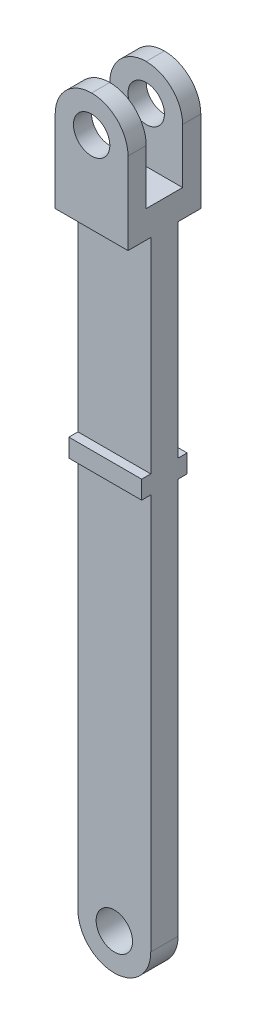
ISO-10303-21;
HEADER;
FILE_DESCRIPTION(('STEP AP214'),'2;1');
FILE_NAME('part.step','',(''),(''),'','','');
FILE_SCHEMA(('AUTOMOTIVE_DESIGN { 1 0 10303 214 1 1 1 1 }'));
ENDSEC;
DATA;
#1=APPLICATION_CONTEXT('core data for automotive mechanical design processes');
#2=APPLICATION_PROTOCOL_DEFINITION('international standard','automotive_design',2000,#1);
#3=PRODUCT_CONTEXT('',#1,'mechanical');
#4=PRODUCT('Part','Part','',(#3));
#5=PRODUCT_RELATED_PRODUCT_CATEGORY('part','',(#4));
#6=PRODUCT_DEFINITION_FORMATION('','',#4);
#7=PRODUCT_DEFINITION_CONTEXT('part definition',#1,'design');
#8=PRODUCT_DEFINITION('design','',#6,#7);
#9=PRODUCT_DEFINITION_SHAPE('','',#8);
#10=(LENGTH_UNIT() NAMED_UNIT(*) SI_UNIT(.MILLI.,.METRE.));
#11=(NAMED_UNIT(*) PLANE_ANGLE_UNIT() SI_UNIT($,.RADIAN.));
#12=(NAMED_UNIT(*) SI_UNIT($,.STERADIAN.) SOLID_ANGLE_UNIT());
#13=UNCERTAINTY_MEASURE_WITH_UNIT(LENGTH_MEASURE(1.E-05),#10,'distance_accuracy_value','');
#14=(GEOMETRIC_REPRESENTATION_CONTEXT(3) GLOBAL_UNCERTAINTY_ASSIGNED_CONTEXT((#13)) GLOBAL_UNIT_ASSIGNED_CONTEXT((#10,
#11,#12)) REPRESENTATION_CONTEXT('',''));
#15=CARTESIAN_POINT('',(0.,0.,0.));
#16=DIRECTION('',(0.,0.,1.));
#17=DIRECTION('',(1.,0.,0.));
#18=AXIS2_PLACEMENT_3D('',#15,#16,#17);
#19=CARTESIAN_POINT('',(4.,32.5,3.));
#20=DIRECTION('',(0.,-1.,0.));
#21=DIRECTION('',(0.,0.,-1.));
#22=AXIS2_PLACEMENT_3D('',#19,#20,#21);
#23=PLANE('',#22);
#24=DIRECTION('',(0.,0.,-1.));
#25=VECTOR('',#24,1.);
#26=CARTESIAN_POINT('',(-4.,32.5,3.));
#27=LINE('',#26,#25);
#28=CARTESIAN_POINT('',(-4.,32.5,3.5));
#29=VERTEX_POINT('',#28);
#30=CARTESIAN_POINT('',(-4.,32.5,-0.5));
#31=VERTEX_POINT('',#30);
#32=EDGE_CURVE('E315',#29,#31,#27,.T.);
#33=ORIENTED_EDGE('',*,*,#32,.F.);
#34=DIRECTION('',(1.,0.,0.));
#35=VECTOR('',#34,1.);
#36=CARTESIAN_POINT('',(-4.,32.5,3.5));
#37=LINE('',#36,#35);
#38=CARTESIAN_POINT('',(4.,32.5,3.5));
#39=VERTEX_POINT('',#38);
#40=EDGE_CURVE('E360',#29,#39,#37,.T.);
#41=ORIENTED_EDGE('',*,*,#40,.T.);
#42=DIRECTION('',(0.,0.,-1.));
#43=VECTOR('',#42,1.);
#44=CARTESIAN_POINT('',(4.,32.5,3.));
#45=LINE('',#44,#43);
#46=CARTESIAN_POINT('',(4.,32.5,-0.5));
#47=VERTEX_POINT('',#46);
#48=EDGE_CURVE('E322',#39,#47,#45,.T.);
#49=ORIENTED_EDGE('',*,*,#48,.T.);
#50=DIRECTION('',(1.,0.,0.));
#51=VECTOR('',#50,1.);
#52=CARTESIAN_POINT('',(-4.,32.5,-0.5));
#53=LINE('',#52,#51);
#54=EDGE_CURVE('E226',#31,#47,#53,.T.);
#55=ORIENTED_EDGE('',*,*,#54,.F.);
#56=EDGE_LOOP('',(#33,#41,#49,#55));
#57=FACE_BOUND('',#56,.T.);
#58=ADVANCED_FACE('F34',(#57),#23,.F.);
#59=CARTESIAN_POINT('',(0.,0.,0.));
#60=DIRECTION('',(0.,0.,1.));
#61=DIRECTION('',(1.,0.,0.));
#62=AXIS2_PLACEMENT_3D('',#59,#60,#61);
#63=PLANE('',#62);
#64=DIRECTION('',(-1.,0.,0.));
#65=VECTOR('',#64,1.);
#66=CARTESIAN_POINT('',(4.,29.5,0.));
#67=LINE('',#66,#65);
#68=CARTESIAN_POINT('',(4.,29.5,0.));
#69=VERTEX_POINT('',#68);
#70=CARTESIAN_POINT('',(-4.,29.5,0.));
#71=VERTEX_POINT('',#70);
#72=EDGE_CURVE('E235',#69,#71,#67,.T.);
#73=ORIENTED_EDGE('',*,*,#72,.F.);
#74=DIRECTION('',(0.,1.,0.));
#75=VECTOR('',#74,1.);
#76=CARTESIAN_POINT('',(4.,-42.5,0.));
#77=LINE('',#76,#75);
#78=CARTESIAN_POINT('',(4.,7.,0.));
#79=VERTEX_POINT('',#78);
#80=EDGE_CURVE('E318',#79,#69,#77,.T.);
#81=ORIENTED_EDGE('',*,*,#80,.F.);
#82=DIRECTION('',(-1.,0.,0.));
#83=VECTOR('',#82,1.);
#84=CARTESIAN_POINT('',(-4.,7.,0.));
#85=LINE('',#84,#83);
#86=CARTESIAN_POINT('',(-4.,7.,0.));
#87=VERTEX_POINT('',#86);
#88=EDGE_CURVE('E254',#79,#87,#85,.T.);
#89=ORIENTED_EDGE('',*,*,#88,.T.);
#90=DIRECTION('',(0.,-1.,0.));
#91=VECTOR('',#90,1.);
#92=CARTESIAN_POINT('',(-4.,-42.5,0.));
#93=LINE('',#92,#91);
#94=EDGE_CURVE('E316',#71,#87,#93,.T.);
#95=ORIENTED_EDGE('',*,*,#94,.F.);
#96=EDGE_LOOP('',(#73,#81,#89,#95));
#97=FACE_BOUND('',#96,.T.);
#98=ADVANCED_FACE('F412',(#97),#63,.F.);
#99=CARTESIAN_POINT('',(0.,0.,3.));
#100=DIRECTION('',(0.,0.,1.));
#101=DIRECTION('',(1.,0.,0.));
#102=AXIS2_PLACEMENT_3D('',#99,#100,#101);
#103=PLANE('',#102);
#104=DIRECTION('',(0.,-1.,0.));
#105=VECTOR('',#104,1.);
#106=CARTESIAN_POINT('',(-4.,-42.5,3.));
#107=LINE('',#106,#105);
#108=CARTESIAN_POINT('',(-4.,5.,3.));
#109=VERTEX_POINT('',#108);
#110=CARTESIAN_POINT('',(-4.,-38.5,3.));
#111=VERTEX_POINT('',#110);
#112=EDGE_CURVE('E312',#109,#111,#107,.T.);
#113=ORIENTED_EDGE('',*,*,#112,.T.);
#114=CARTESIAN_POINT('',(0.,-38.5,3.));
#115=DIRECTION('',(0.,0.,1.));
#116=DIRECTION('',(1.,0.,0.));
#117=AXIS2_PLACEMENT_3D('',#114,#115,#116);
#118=CIRCLE('',#117,4.);
#119=CARTESIAN_POINT('',(0.,-42.5,3.));
#120=VERTEX_POINT('',#119);
#121=EDGE_CURVE('E337',#111,#120,#118,.T.);
#122=ORIENTED_EDGE('',*,*,#121,.T.);
#123=CARTESIAN_POINT('',(0.,-38.5,3.));
#124=DIRECTION('',(0.,0.,1.));
#125=DIRECTION('',(1.,0.,0.));
#126=AXIS2_PLACEMENT_3D('',#123,#124,#125);
#127=CIRCLE('',#126,4.);
#128=CARTESIAN_POINT('',(4.,-38.5,3.));
#129=VERTEX_POINT('',#128);
#130=EDGE_CURVE('E335',#120,#129,#127,.T.);
#131=ORIENTED_EDGE('',*,*,#130,.T.);
#132=DIRECTION('',(0.,1.,0.));
#133=VECTOR('',#132,1.);
#134=CARTESIAN_POINT('',(4.,-42.5,3.));
#135=LINE('',#134,#133);
#136=CARTESIAN_POINT('',(4.,5.,3.));
#137=VERTEX_POINT('',#136);
#138=EDGE_CURVE('E313',#129,#137,#135,.T.);
#139=ORIENTED_EDGE('',*,*,#138,.T.);
#140=DIRECTION('',(1.,0.,0.));
#141=VECTOR('',#140,1.);
#142=CARTESIAN_POINT('',(-4.,5.,3.));
#143=LINE('',#142,#141);
#144=EDGE_CURVE('E282',#109,#137,#143,.T.);
#145=ORIENTED_EDGE('',*,*,#144,.F.);
#146=EDGE_LOOP('',(#113,#122,#131,#139,#145));
#147=FACE_BOUND('',#146,.T.);
#148=CARTESIAN_POINT('',(0.,-38.5,3.));
#149=DIRECTION('',(0.,0.,1.));
#150=DIRECTION('',(1.,0.,0.));
#151=AXIS2_PLACEMENT_3D('',#148,#149,#150);
#152=CIRCLE('',#151,2.);
#153=CARTESIAN_POINT('',(2.,-38.5,3.));
#154=VERTEX_POINT('',#153);
#155=EDGE_CURVE('E303',#154,#154,#152,.T.);
#156=ORIENTED_EDGE('',*,*,#155,.F.);
#157=EDGE_LOOP('',(#156));
#158=FACE_BOUND('',#157,.T.);
#159=ADVANCED_FACE('F439',(#147,#158),#103,.T.);
#160=CARTESIAN_POINT('',(-4.,-42.5,3.));
#161=DIRECTION('',(1.,0.,0.));
#162=DIRECTION('',(0.,0.,-1.));
#163=AXIS2_PLACEMENT_3D('',#160,#161,#162);
#164=PLANE('',#163);
#165=DIRECTION('',(0.,1.,0.));
#166=VECTOR('',#165,1.);
#167=CARTESIAN_POINT('',(-4.,29.5,5.5));
#168=LINE('',#167,#166);
#169=CARTESIAN_POINT('',(-4.,29.5,5.5));
#170=VERTEX_POINT('',#169);
#171=CARTESIAN_POINT('',(-4.,38.5,5.5));
#172=VERTEX_POINT('',#171);
#173=EDGE_CURVE('E194',#170,#172,#168,.T.);
#174=ORIENTED_EDGE('',*,*,#173,.T.);
#175=DIRECTION('',(0.,0.,-1.));
#176=VECTOR('',#175,1.);
#177=CARTESIAN_POINT('',(-4.,38.5,3.5));
#178=LINE('',#177,#176);
#179=CARTESIAN_POINT('',(-4.,38.5,3.5));
#180=VERTEX_POINT('',#179);
#181=EDGE_CURVE('E352',#172,#180,#178,.T.);
#182=ORIENTED_EDGE('',*,*,#181,.T.);
#183=DIRECTION('',(0.,-1.,0.));
#184=VECTOR('',#183,1.);
#185=CARTESIAN_POINT('',(-4.,42.5,3.5));
#186=LINE('',#185,#184);
#187=EDGE_CURVE('E373',#180,#29,#186,.T.);
#188=ORIENTED_EDGE('',*,*,#187,.T.);
#189=ORIENTED_EDGE('',*,*,#32,.T.);
#190=DIRECTION('',(0.,-1.,0.));
#191=VECTOR('',#190,1.);
#192=CARTESIAN_POINT('',(-4.,42.5,-0.5));
#193=LINE('',#192,#191);
#194=CARTESIAN_POINT('',(-4.,38.5,-0.5));
#195=VERTEX_POINT('',#194);
#196=EDGE_CURVE('E232',#195,#31,#193,.T.);
#197=ORIENTED_EDGE('',*,*,#196,.F.);
#198=DIRECTION('',(0.,0.,1.));
#199=VECTOR('',#198,1.);
#200=CARTESIAN_POINT('',(-4.,38.5,-2.5));
#201=LINE('',#200,#199);
#202=CARTESIAN_POINT('',(-4.,38.5,-2.5));
#203=VERTEX_POINT('',#202);
#204=EDGE_CURVE('E330',#195,#203,#201,.F.);
#205=ORIENTED_EDGE('',*,*,#204,.T.);
#206=DIRECTION('',(0.,1.,0.));
#207=VECTOR('',#206,1.);
#208=CARTESIAN_POINT('',(-4.,29.5,-2.5));
#209=LINE('',#208,#207);
#210=CARTESIAN_POINT('',(-4.,29.5,-2.5));
#211=VERTEX_POINT('',#210);
#212=EDGE_CURVE('E236',#211,#203,#209,.T.);
#213=ORIENTED_EDGE('',*,*,#212,.F.);
#214=DIRECTION('',(0.,0.,1.));
#215=VECTOR('',#214,1.);
#216=CARTESIAN_POINT('',(-4.,29.5,-2.5));
#217=LINE('',#216,#215);
#218=EDGE_CURVE('E243',#211,#71,#217,.T.);
#219=ORIENTED_EDGE('',*,*,#218,.T.);
#220=ORIENTED_EDGE('',*,*,#94,.T.);
#221=DIRECTION('',(0.,0.,1.));
#222=VECTOR('',#221,1.);
#223=CARTESIAN_POINT('',(-4.,7.,-1.));
#224=LINE('',#223,#222);
#225=CARTESIAN_POINT('',(-4.,7.,-1.));
#226=VERTEX_POINT('',#225);
#227=EDGE_CURVE('E269',#226,#87,#224,.T.);
#228=ORIENTED_EDGE('',*,*,#227,.F.);
#229=DIRECTION('',(0.,-1.,0.));
#230=VECTOR('',#229,1.);
#231=CARTESIAN_POINT('',(-4.,5.,-1.));
#232=LINE('',#231,#230);
#233=CARTESIAN_POINT('',(-4.,5.,-1.));
#234=VERTEX_POINT('',#233);
#235=EDGE_CURVE('E257',#226,#234,#232,.T.);
#236=ORIENTED_EDGE('',*,*,#235,.T.);
#237=DIRECTION('',(0.,0.,1.));
#238=VECTOR('',#237,1.);
#239=CARTESIAN_POINT('',(-4.,5.,-1.));
#240=LINE('',#239,#238);
#241=CARTESIAN_POINT('',(-4.,5.,0.));
#242=VERTEX_POINT('',#241);
#243=EDGE_CURVE('E272',#234,#242,#240,.T.);
#244=ORIENTED_EDGE('',*,*,#243,.T.);
#245=CARTESIAN_POINT('',(-4.,-38.5,0.));
#246=VERTEX_POINT('',#245);
#247=EDGE_CURVE('E307',#242,#246,#93,.T.);
#248=ORIENTED_EDGE('',*,*,#247,.T.);
#249=DIRECTION('',(0.,0.,-1.));
#250=VECTOR('',#249,1.);
#251=CARTESIAN_POINT('',(-4.,-38.5,3.));
#252=LINE('',#251,#250);
#253=EDGE_CURVE('E332',#246,#111,#252,.F.);
#254=ORIENTED_EDGE('',*,*,#253,.T.);
#255=ORIENTED_EDGE('',*,*,#112,.F.);
#256=DIRECTION('',(0.,0.,-1.));
#257=VECTOR('',#256,1.);
#258=CARTESIAN_POINT('',(-4.,5.,4.));
#259=LINE('',#258,#257);
#260=CARTESIAN_POINT('',(-4.,5.,4.));
#261=VERTEX_POINT('',#260);
#262=EDGE_CURVE('E295',#261,#109,#259,.T.);
#263=ORIENTED_EDGE('',*,*,#262,.F.);
#264=DIRECTION('',(0.,-1.,0.));
#265=VECTOR('',#264,1.);
#266=CARTESIAN_POINT('',(-4.,5.,4.));
#267=LINE('',#266,#265);
#268=CARTESIAN_POINT('',(-4.,7.,4.));
#269=VERTEX_POINT('',#268);
#270=EDGE_CURVE('E284',#269,#261,#267,.T.);
#271=ORIENTED_EDGE('',*,*,#270,.F.);
#272=DIRECTION('',(0.,0.,-1.));
#273=VECTOR('',#272,1.);
#274=CARTESIAN_POINT('',(-4.,7.,4.));
#275=LINE('',#274,#273);
#276=CARTESIAN_POINT('',(-4.,7.,3.));
#277=VERTEX_POINT('',#276);
#278=EDGE_CURVE('E298',#269,#277,#275,.T.);
#279=ORIENTED_EDGE('',*,*,#278,.T.);
#280=CARTESIAN_POINT('',(-4.,29.5,3.));
#281=VERTEX_POINT('',#280);
#282=EDGE_CURVE('E197',#281,#277,#107,.T.);
#283=ORIENTED_EDGE('',*,*,#282,.F.);
#284=DIRECTION('',(0.,0.,-1.));
#285=VECTOR('',#284,1.);
#286=CARTESIAN_POINT('',(-4.,29.5,5.5));
#287=LINE('',#286,#285);
#288=EDGE_CURVE('E190',#170,#281,#287,.T.);
#289=ORIENTED_EDGE('',*,*,#288,.F.);
#290=EDGE_LOOP('',(#174,#182,#188,#189,#197,#205,#213,#219,#220,#228,#236,#244,#248,#254,#255,
#263,#271,#279,#283,#289));
#291=FACE_BOUND('',#290,.T.);
#292=ADVANCED_FACE('F192',(#291),#164,.F.);
#293=CARTESIAN_POINT('',(4.,-42.5,3.));
#294=DIRECTION('',(-1.,0.,0.));
#295=DIRECTION('',(0.,-1.,0.));
#296=AXIS2_PLACEMENT_3D('',#293,#294,#295);
#297=PLANE('',#296);
#298=DIRECTION('',(0.,-1.,0.));
#299=VECTOR('',#298,1.);
#300=CARTESIAN_POINT('',(4.,42.5,3.5));
#301=LINE('',#300,#299);
#302=CARTESIAN_POINT('',(4.,38.5,3.5));
#303=VERTEX_POINT('',#302);
#304=EDGE_CURVE('E219',#303,#39,#301,.T.);
#305=ORIENTED_EDGE('',*,*,#304,.F.);
#306=DIRECTION('',(0.,0.,1.));
#307=VECTOR('',#306,1.);
#308=CARTESIAN_POINT('',(4.,38.5,5.5));
#309=LINE('',#308,#307);
#310=CARTESIAN_POINT('',(4.,38.5,5.5));
#311=VERTEX_POINT('',#310);
#312=EDGE_CURVE('E11',#303,#311,#309,.T.);
#313=ORIENTED_EDGE('',*,*,#312,.T.);
#314=DIRECTION('',(0.,-1.,0.));
#315=VECTOR('',#314,1.);
#316=CARTESIAN_POINT('',(4.,29.5,5.5));
#317=LINE('',#316,#315);
#318=CARTESIAN_POINT('',(4.,29.5,5.5));
#319=VERTEX_POINT('',#318);
#320=EDGE_CURVE('E213',#311,#319,#317,.T.);
#321=ORIENTED_EDGE('',*,*,#320,.T.);
#322=DIRECTION('',(0.,0.,-1.));
#323=VECTOR('',#322,1.);
#324=CARTESIAN_POINT('',(4.,29.5,5.5));
#325=LINE('',#324,#323);
#326=CARTESIAN_POINT('',(4.,29.5,3.));
#327=VERTEX_POINT('',#326);
#328=EDGE_CURVE('E202',#319,#327,#325,.T.);
#329=ORIENTED_EDGE('',*,*,#328,.T.);
#330=CARTESIAN_POINT('',(4.,7.,3.));
#331=VERTEX_POINT('',#330);
#332=EDGE_CURVE('E311',#331,#327,#135,.T.);
#333=ORIENTED_EDGE('',*,*,#332,.F.);
#334=DIRECTION('',(0.,0.,-1.));
#335=VECTOR('',#334,1.);
#336=CARTESIAN_POINT('',(4.,7.,4.));
#337=LINE('',#336,#335);
#338=CARTESIAN_POINT('',(4.,7.,4.));
#339=VERTEX_POINT('',#338);
#340=EDGE_CURVE('E300',#339,#331,#337,.T.);
#341=ORIENTED_EDGE('',*,*,#340,.F.);
#342=DIRECTION('',(0.,1.,0.));
#343=VECTOR('',#342,1.);
#344=CARTESIAN_POINT('',(4.,5.,4.));
#345=LINE('',#344,#343);
#346=CARTESIAN_POINT('',(4.,5.,4.));
#347=VERTEX_POINT('',#346);
#348=EDGE_CURVE('E278',#347,#339,#345,.T.);
#349=ORIENTED_EDGE('',*,*,#348,.F.);
#350=DIRECTION('',(0.,0.,-1.));
#351=VECTOR('',#350,1.);
#352=CARTESIAN_POINT('',(4.,5.,4.));
#353=LINE('',#352,#351);
#354=EDGE_CURVE('E288',#347,#137,#353,.T.);
#355=ORIENTED_EDGE('',*,*,#354,.T.);
#356=ORIENTED_EDGE('',*,*,#138,.F.);
#357=DIRECTION('',(0.,0.,-1.));
#358=VECTOR('',#357,1.);
#359=CARTESIAN_POINT('',(4.,-38.5,3.));
#360=LINE('',#359,#358);
#361=CARTESIAN_POINT('',(4.,-38.5,0.));
#362=VERTEX_POINT('',#361);
#363=EDGE_CURVE('E342',#129,#362,#360,.T.);
#364=ORIENTED_EDGE('',*,*,#363,.T.);
#365=CARTESIAN_POINT('',(4.,5.,0.));
#366=VERTEX_POINT('',#365);
#367=EDGE_CURVE('E319',#362,#366,#77,.T.);
#368=ORIENTED_EDGE('',*,*,#367,.T.);
#369=DIRECTION('',(0.,0.,1.));
#370=VECTOR('',#369,1.);
#371=CARTESIAN_POINT('',(4.,5.,-1.));
#372=LINE('',#371,#370);
#373=CARTESIAN_POINT('',(4.,5.,-1.));
#374=VERTEX_POINT('',#373);
#375=EDGE_CURVE('E274',#374,#366,#372,.T.);
#376=ORIENTED_EDGE('',*,*,#375,.F.);
#377=DIRECTION('',(0.,1.,0.));
#378=VECTOR('',#377,1.);
#379=CARTESIAN_POINT('',(4.,5.,-1.));
#380=LINE('',#379,#378);
#381=CARTESIAN_POINT('',(4.,7.,-1.));
#382=VERTEX_POINT('',#381);
#383=EDGE_CURVE('E250',#374,#382,#380,.T.);
#384=ORIENTED_EDGE('',*,*,#383,.T.);
#385=DIRECTION('',(0.,0.,1.));
#386=VECTOR('',#385,1.);
#387=CARTESIAN_POINT('',(4.,7.,-1.));
#388=LINE('',#387,#386);
#389=EDGE_CURVE('E263',#382,#79,#388,.T.);
#390=ORIENTED_EDGE('',*,*,#389,.T.);
#391=ORIENTED_EDGE('',*,*,#80,.T.);
#392=DIRECTION('',(0.,0.,1.));
#393=VECTOR('',#392,1.);
#394=CARTESIAN_POINT('',(4.,29.5,-2.5));
#395=LINE('',#394,#393);
#396=CARTESIAN_POINT('',(4.,29.5,-2.5));
#397=VERTEX_POINT('',#396);
#398=EDGE_CURVE('E247',#397,#69,#395,.T.);
#399=ORIENTED_EDGE('',*,*,#398,.F.);
#400=DIRECTION('',(0.,-1.,0.));
#401=VECTOR('',#400,1.);
#402=CARTESIAN_POINT('',(4.,29.5,-2.5));
#403=LINE('',#402,#401);
#404=CARTESIAN_POINT('',(4.,38.5,-2.5));
#405=VERTEX_POINT('',#404);
#406=EDGE_CURVE('E239',#405,#397,#403,.T.);
#407=ORIENTED_EDGE('',*,*,#406,.F.);
#408=DIRECTION('',(0.,0.,-1.));
#409=VECTOR('',#408,1.);
#410=CARTESIAN_POINT('',(4.,38.5,-0.5));
#411=LINE('',#410,#409);
#412=CARTESIAN_POINT('',(4.,38.5,-0.5));
#413=VERTEX_POINT('',#412);
#414=EDGE_CURVE('E339',#405,#413,#411,.F.);
#415=ORIENTED_EDGE('',*,*,#414,.T.);
#416=DIRECTION('',(0.,-1.,0.));
#417=VECTOR('',#416,1.);
#418=CARTESIAN_POINT('',(4.,42.5,-0.5));
#419=LINE('',#418,#417);
#420=EDGE_CURVE('E229',#413,#47,#419,.T.);
#421=ORIENTED_EDGE('',*,*,#420,.T.);
#422=ORIENTED_EDGE('',*,*,#48,.F.);
#423=EDGE_LOOP('',(#305,#313,#321,#329,#333,#341,#349,#355,#356,#364,#368,#376,#384,#390,#391,
#399,#407,#415,#421,#422));
#424=FACE_BOUND('',#423,.T.);
#425=ADVANCED_FACE('F389',(#424),#297,.F.);
#426=DIRECTION('',(-1.,0.,0.));
#427=VECTOR('',#426,1.);
#428=CARTESIAN_POINT('',(4.,29.5,3.));
#429=LINE('',#428,#427);
#430=EDGE_CURVE('E208',#327,#281,#429,.T.);
#431=ORIENTED_EDGE('',*,*,#430,.T.);
#432=ORIENTED_EDGE('',*,*,#282,.T.);
#433=DIRECTION('',(-1.,0.,0.));
#434=VECTOR('',#433,1.);
#435=CARTESIAN_POINT('',(-4.,7.,3.));
#436=LINE('',#435,#434);
#437=EDGE_CURVE('E277',#331,#277,#436,.T.);
#438=ORIENTED_EDGE('',*,*,#437,.F.);
#439=ORIENTED_EDGE('',*,*,#332,.T.);
#440=EDGE_LOOP('',(#431,#432,#438,#439));
#441=FACE_BOUND('',#440,.T.);
#442=ADVANCED_FACE('F450',(#441),#103,.T.);
#443=CARTESIAN_POINT('',(0.,-38.5,0.));
#444=DIRECTION('',(0.,0.,1.));
#445=DIRECTION('',(1.,0.,0.));
#446=AXIS2_PLACEMENT_3D('',#443,#444,#445);
#447=CIRCLE('',#446,2.);
#448=CARTESIAN_POINT('',(2.,-38.5,0.));
#449=VERTEX_POINT('',#448);
#450=EDGE_CURVE('E304',#449,#449,#447,.T.);
#451=ORIENTED_EDGE('',*,*,#450,.T.);
#452=EDGE_LOOP('',(#451));
#453=FACE_BOUND('',#452,.T.);
#454=CARTESIAN_POINT('',(0.,-38.5,0.));
#455=DIRECTION('',(0.,0.,1.));
#456=DIRECTION('',(1.,0.,0.));
#457=AXIS2_PLACEMENT_3D('',#454,#455,#456);
#458=CIRCLE('',#457,4.);
#459=CARTESIAN_POINT('',(0.,-42.5,0.));
#460=VERTEX_POINT('',#459);
#461=EDGE_CURVE('E324',#362,#460,#458,.F.);
#462=ORIENTED_EDGE('',*,*,#461,.T.);
#463=CARTESIAN_POINT('',(0.,-38.5,0.));
#464=DIRECTION('',(0.,0.,1.));
#465=DIRECTION('',(1.,0.,0.));
#466=AXIS2_PLACEMENT_3D('',#463,#464,#465);
#467=CIRCLE('',#466,4.);
#468=EDGE_CURVE('E328',#460,#246,#467,.F.);
#469=ORIENTED_EDGE('',*,*,#468,.T.);
#470=ORIENTED_EDGE('',*,*,#247,.F.);
#471=DIRECTION('',(1.,0.,0.));
#472=VECTOR('',#471,1.);
#473=CARTESIAN_POINT('',(-4.,5.,0.));
#474=LINE('',#473,#472);
#475=EDGE_CURVE('E249',#242,#366,#474,.T.);
#476=ORIENTED_EDGE('',*,*,#475,.T.);
#477=ORIENTED_EDGE('',*,*,#367,.F.);
#478=EDGE_LOOP('',(#462,#469,#470,#476,#477));
#479=FACE_BOUND('',#478,.T.);
#480=ADVANCED_FACE('F447',(#453,#479),#63,.F.);
#481=CARTESIAN_POINT('',(0.,-38.5,0.));
#482=DIRECTION('',(0.,0.,1.));
#483=DIRECTION('',(1.,0.,0.));
#484=AXIS2_PLACEMENT_3D('',#481,#482,#483);
#485=CYLINDRICAL_SURFACE('',#484,2.);
#486=ORIENTED_EDGE('',*,*,#450,.F.);
#487=EDGE_LOOP('',(#486));
#488=FACE_BOUND('',#487,.T.);
#489=ORIENTED_EDGE('',*,*,#155,.T.);
#490=EDGE_LOOP('',(#489));
#491=FACE_BOUND('',#490,.T.);
#492=ADVANCED_FACE('F449',(#488,#491),#485,.F.);
#493=CARTESIAN_POINT('',(-4.,7.,4.));
#494=DIRECTION('',(0.,-1.,0.));
#495=DIRECTION('',(0.,0.,-1.));
#496=AXIS2_PLACEMENT_3D('',#493,#494,#495);
#497=PLANE('',#496);
#498=ORIENTED_EDGE('',*,*,#437,.T.);
#499=ORIENTED_EDGE('',*,*,#278,.F.);
#500=DIRECTION('',(-1.,0.,0.));
#501=VECTOR('',#500,1.);
#502=CARTESIAN_POINT('',(-4.,7.,4.));
#503=LINE('',#502,#501);
#504=EDGE_CURVE('E281',#339,#269,#503,.T.);
#505=ORIENTED_EDGE('',*,*,#504,.F.);
#506=ORIENTED_EDGE('',*,*,#340,.T.);
#507=EDGE_LOOP('',(#498,#499,#505,#506));
#508=FACE_BOUND('',#507,.T.);
#509=ADVANCED_FACE('F457',(#508),#497,.F.);
#510=CARTESIAN_POINT('',(-4.,5.,4.));
#511=DIRECTION('',(0.,1.,0.));
#512=DIRECTION('',(0.,0.,1.));
#513=AXIS2_PLACEMENT_3D('',#510,#511,#512);
#514=PLANE('',#513);
#515=ORIENTED_EDGE('',*,*,#144,.T.);
#516=ORIENTED_EDGE('',*,*,#354,.F.);
#517=DIRECTION('',(1.,0.,0.));
#518=VECTOR('',#517,1.);
#519=CARTESIAN_POINT('',(-4.,5.,4.));
#520=LINE('',#519,#518);
#521=EDGE_CURVE('E286',#261,#347,#520,.T.);
#522=ORIENTED_EDGE('',*,*,#521,.F.);
#523=ORIENTED_EDGE('',*,*,#262,.T.);
#524=EDGE_LOOP('',(#515,#516,#522,#523));
#525=FACE_BOUND('',#524,.T.);
#526=ADVANCED_FACE('F525',(#525),#514,.F.);
#527=CARTESIAN_POINT('',(0.,0.,4.));
#528=DIRECTION('',(0.,0.,-1.));
#529=DIRECTION('',(-1.,0.,0.));
#530=AXIS2_PLACEMENT_3D('',#527,#528,#529);
#531=PLANE('',#530);
#532=ORIENTED_EDGE('',*,*,#348,.T.);
#533=ORIENTED_EDGE('',*,*,#504,.T.);
#534=ORIENTED_EDGE('',*,*,#270,.T.);
#535=ORIENTED_EDGE('',*,*,#521,.T.);
#536=EDGE_LOOP('',(#532,#533,#534,#535));
#537=FACE_BOUND('',#536,.T.);
#538=ADVANCED_FACE('F522',(#537),#531,.F.);
#539=CARTESIAN_POINT('',(-4.,5.,-1.));
#540=DIRECTION('',(0.,-1.,0.));
#541=DIRECTION('',(0.,0.,-1.));
#542=AXIS2_PLACEMENT_3D('',#539,#540,#541);
#543=PLANE('',#542);
#544=ORIENTED_EDGE('',*,*,#475,.F.);
#545=ORIENTED_EDGE('',*,*,#243,.F.);
#546=DIRECTION('',(1.,0.,0.));
#547=VECTOR('',#546,1.);
#548=CARTESIAN_POINT('',(-4.,5.,-1.));
#549=LINE('',#548,#547);
#550=EDGE_CURVE('E253',#234,#374,#549,.T.);
#551=ORIENTED_EDGE('',*,*,#550,.T.);
#552=ORIENTED_EDGE('',*,*,#375,.T.);
#553=EDGE_LOOP('',(#544,#545,#551,#552));
#554=FACE_BOUND('',#553,.T.);
#555=ADVANCED_FACE('F426',(#554),#543,.T.);
#556=CARTESIAN_POINT('',(-4.,7.,-1.));
#557=DIRECTION('',(0.,1.,0.));
#558=DIRECTION('',(0.,0.,1.));
#559=AXIS2_PLACEMENT_3D('',#556,#557,#558);
#560=PLANE('',#559);
#561=ORIENTED_EDGE('',*,*,#88,.F.);
#562=ORIENTED_EDGE('',*,*,#389,.F.);
#563=DIRECTION('',(-1.,0.,0.));
#564=VECTOR('',#563,1.);
#565=CARTESIAN_POINT('',(-4.,7.,-1.));
#566=LINE('',#565,#564);
#567=EDGE_CURVE('E260',#382,#226,#566,.T.);
#568=ORIENTED_EDGE('',*,*,#567,.T.);
#569=ORIENTED_EDGE('',*,*,#227,.T.);
#570=EDGE_LOOP('',(#561,#562,#568,#569));
#571=FACE_BOUND('',#570,.T.);
#572=ADVANCED_FACE('F417',(#571),#560,.T.);
#573=CARTESIAN_POINT('',(0.,0.,-1.));
#574=DIRECTION('',(0.,0.,1.));
#575=DIRECTION('',(-1.,0.,0.));
#576=AXIS2_PLACEMENT_3D('',#573,#574,#575);
#577=PLANE('',#576);
#578=ORIENTED_EDGE('',*,*,#383,.F.);
#579=ORIENTED_EDGE('',*,*,#550,.F.);
#580=ORIENTED_EDGE('',*,*,#235,.F.);
#581=ORIENTED_EDGE('',*,*,#567,.F.);
#582=EDGE_LOOP('',(#578,#579,#580,#581));
#583=FACE_BOUND('',#582,.T.);
#584=ADVANCED_FACE('F423',(#583),#577,.F.);
#585=CARTESIAN_POINT('',(4.,29.5,-2.5));
#586=DIRECTION('',(0.,1.,0.));
#587=DIRECTION('',(0.,0.,1.));
#588=AXIS2_PLACEMENT_3D('',#585,#586,#587);
#589=PLANE('',#588);
#590=ORIENTED_EDGE('',*,*,#72,.T.);
#591=ORIENTED_EDGE('',*,*,#218,.F.);
#592=DIRECTION('',(-1.,0.,0.));
#593=VECTOR('',#592,1.);
#594=CARTESIAN_POINT('',(4.,29.5,-2.5));
#595=LINE('',#594,#593);
#596=EDGE_CURVE('E241',#397,#211,#595,.T.);
#597=ORIENTED_EDGE('',*,*,#596,.F.);
#598=ORIENTED_EDGE('',*,*,#398,.T.);
#599=EDGE_LOOP('',(#590,#591,#597,#598));
#600=FACE_BOUND('',#599,.T.);
#601=ADVANCED_FACE('F512',(#600),#589,.F.);
#602=CARTESIAN_POINT('',(0.,0.,-2.5));
#603=DIRECTION('',(0.,0.,1.));
#604=DIRECTION('',(1.,0.,0.));
#605=AXIS2_PLACEMENT_3D('',#602,#603,#604);
#606=PLANE('',#605);
#607=CARTESIAN_POINT('',(0.,38.5,-2.5));
#608=DIRECTION('',(0.,0.,-1.));
#609=DIRECTION('',(-1.,0.,0.));
#610=AXIS2_PLACEMENT_3D('',#607,#608,#609);
#611=CIRCLE('',#610,2.);
#612=CARTESIAN_POINT('',(-2.,38.5,-2.5));
#613=VERTEX_POINT('',#612);
#614=EDGE_CURVE('E221',#613,#613,#611,.T.);
#615=ORIENTED_EDGE('',*,*,#614,.F.);
#616=EDGE_LOOP('',(#615));
#617=FACE_BOUND('',#616,.T.);
#618=CARTESIAN_POINT('',(0.,38.5,-2.5));
#619=DIRECTION('',(0.,0.,1.));
#620=DIRECTION('',(1.,0.,0.));
#621=AXIS2_PLACEMENT_3D('',#618,#619,#620);
#622=CIRCLE('',#621,4.);
#623=CARTESIAN_POINT('',(0.,42.5,-2.5));
#624=VERTEX_POINT('',#623);
#625=EDGE_CURVE('E344',#203,#624,#622,.F.);
#626=ORIENTED_EDGE('',*,*,#625,.T.);
#627=CARTESIAN_POINT('',(0.,38.5,-2.5));
#628=DIRECTION('',(0.,0.,1.));
#629=DIRECTION('',(1.,0.,0.));
#630=AXIS2_PLACEMENT_3D('',#627,#628,#629);
#631=CIRCLE('',#630,4.);
#632=EDGE_CURVE('E346',#624,#405,#631,.F.);
#633=ORIENTED_EDGE('',*,*,#632,.T.);
#634=ORIENTED_EDGE('',*,*,#406,.T.);
#635=ORIENTED_EDGE('',*,*,#596,.T.);
#636=ORIENTED_EDGE('',*,*,#212,.T.);
#637=EDGE_LOOP('',(#626,#633,#634,#635,#636));
#638=FACE_BOUND('',#637,.T.);
#639=ADVANCED_FACE('F405',(#617,#638),#606,.F.);
#640=CARTESIAN_POINT('',(-4.,42.5,-0.5));
#641=DIRECTION('',(0.,0.,-1.));
#642=DIRECTION('',(-1.,0.,0.));
#643=AXIS2_PLACEMENT_3D('',#640,#641,#642);
#644=PLANE('',#643);
#645=CARTESIAN_POINT('',(0.,38.5,-0.5));
#646=DIRECTION('',(0.,0.,-1.));
#647=DIRECTION('',(-1.,0.,0.));
#648=AXIS2_PLACEMENT_3D('',#645,#646,#647);
#649=CIRCLE('',#648,2.);
#650=CARTESIAN_POINT('',(-2.,38.5,-0.5));
#651=VERTEX_POINT('',#650);
#652=EDGE_CURVE('E224',#651,#651,#649,.T.);
#653=ORIENTED_EDGE('',*,*,#652,.T.);
#654=EDGE_LOOP('',(#653));
#655=FACE_BOUND('',#654,.T.);
#656=ORIENTED_EDGE('',*,*,#420,.F.);
#657=CARTESIAN_POINT('',(0.,38.5,-0.5));
#658=DIRECTION('',(0.,0.,-1.));
#659=DIRECTION('',(-1.,0.,0.));
#660=AXIS2_PLACEMENT_3D('',#657,#658,#659);
#661=CIRCLE('',#660,4.);
#662=CARTESIAN_POINT('',(0.,42.5,-0.5));
#663=VERTEX_POINT('',#662);
#664=EDGE_CURVE('E350',#413,#663,#661,.F.);
#665=ORIENTED_EDGE('',*,*,#664,.T.);
#666=CARTESIAN_POINT('',(0.,38.5,-0.5));
#667=DIRECTION('',(0.,0.,-1.));
#668=DIRECTION('',(-1.,0.,0.));
#669=AXIS2_PLACEMENT_3D('',#666,#667,#668);
#670=CIRCLE('',#669,4.);
#671=EDGE_CURVE('E348',#663,#195,#670,.F.);
#672=ORIENTED_EDGE('',*,*,#671,.T.);
#673=ORIENTED_EDGE('',*,*,#196,.T.);
#674=ORIENTED_EDGE('',*,*,#54,.T.);
#675=EDGE_LOOP('',(#656,#665,#672,#673,#674));
#676=FACE_BOUND('',#675,.T.);
#677=ADVANCED_FACE('F394',(#655,#676),#644,.F.);
#678=CARTESIAN_POINT('',(0.,38.5,16.));
#679=DIRECTION('',(0.,0.,-1.));
#680=DIRECTION('',(-1.,0.,0.));
#681=AXIS2_PLACEMENT_3D('',#678,#679,#680);
#682=CYLINDRICAL_SURFACE('',#681,2.);
#683=ORIENTED_EDGE('',*,*,#614,.T.);
#684=EDGE_LOOP('',(#683));
#685=FACE_BOUND('',#684,.T.);
#686=ORIENTED_EDGE('',*,*,#652,.F.);
#687=EDGE_LOOP('',(#686));
#688=FACE_BOUND('',#687,.T.);
#689=ADVANCED_FACE('F476',(#685,#688),#682,.F.);
#690=CARTESIAN_POINT('',(0.,-38.5,3.));
#691=DIRECTION('',(0.,0.,-1.));
#692=DIRECTION('',(-1.,0.,0.));
#693=AXIS2_PLACEMENT_3D('',#690,#691,#692);
#694=CYLINDRICAL_SURFACE('',#693,4.);
#695=ORIENTED_EDGE('',*,*,#363,.F.);
#696=ORIENTED_EDGE('',*,*,#130,.F.);
#697=DIRECTION('',(0.,0.,-1.));
#698=VECTOR('',#697,1.);
#699=CARTESIAN_POINT('',(0.,-42.5,3.));
#700=LINE('',#699,#698);
#701=EDGE_CURVE('E225',#460,#120,#700,.F.);
#702=ORIENTED_EDGE('',*,*,#701,.F.);
#703=ORIENTED_EDGE('',*,*,#461,.F.);
#704=EDGE_LOOP('',(#695,#696,#702,#703));
#705=FACE_BOUND('',#704,.T.);
#706=ADVANCED_FACE('F444',(#705),#694,.T.);
#707=CARTESIAN_POINT('',(0.,-38.5,3.));
#708=DIRECTION('',(0.,0.,-1.));
#709=DIRECTION('',(-1.,0.,0.));
#710=AXIS2_PLACEMENT_3D('',#707,#708,#709);
#711=CYLINDRICAL_SURFACE('',#710,4.);
#712=ORIENTED_EDGE('',*,*,#121,.F.);
#713=ORIENTED_EDGE('',*,*,#253,.F.);
#714=ORIENTED_EDGE('',*,*,#468,.F.);
#715=ORIENTED_EDGE('',*,*,#701,.T.);
#716=EDGE_LOOP('',(#712,#713,#714,#715));
#717=FACE_BOUND('',#716,.T.);
#718=ADVANCED_FACE('F435',(#717),#711,.T.);
#719=CARTESIAN_POINT('',(0.,38.5,0.));
#720=DIRECTION('',(0.,0.,-1.));
#721=DIRECTION('',(-1.,0.,0.));
#722=AXIS2_PLACEMENT_3D('',#719,#720,#721);
#723=CYLINDRICAL_SURFACE('',#722,4.);
#724=ORIENTED_EDGE('',*,*,#204,.F.);
#725=ORIENTED_EDGE('',*,*,#671,.F.);
#726=DIRECTION('',(0.,0.,1.));
#727=VECTOR('',#726,1.);
#728=CARTESIAN_POINT('',(0.,42.5,-0.5));
#729=LINE('',#728,#727);
#730=EDGE_CURVE('E201',#624,#663,#729,.T.);
#731=ORIENTED_EDGE('',*,*,#730,.F.);
#732=ORIENTED_EDGE('',*,*,#625,.F.);
#733=EDGE_LOOP('',(#724,#725,#731,#732));
#734=FACE_BOUND('',#733,.T.);
#735=ADVANCED_FACE('F401',(#734),#723,.T.);
#736=CARTESIAN_POINT('',(0.,38.5,0.));
#737=DIRECTION('',(0.,0.,1.));
#738=DIRECTION('',(1.,0.,0.));
#739=AXIS2_PLACEMENT_3D('',#736,#737,#738);
#740=CYLINDRICAL_SURFACE('',#739,4.);
#741=ORIENTED_EDGE('',*,*,#664,.F.);
#742=ORIENTED_EDGE('',*,*,#414,.F.);
#743=ORIENTED_EDGE('',*,*,#632,.F.);
#744=ORIENTED_EDGE('',*,*,#730,.T.);
#745=EDGE_LOOP('',(#741,#742,#743,#744));
#746=FACE_BOUND('',#745,.T.);
#747=ADVANCED_FACE('F477',(#746),#740,.T.);
#748=CARTESIAN_POINT('',(4.,29.5,5.5));
#749=DIRECTION('',(0.,-1.,0.));
#750=DIRECTION('',(0.,0.,-1.));
#751=AXIS2_PLACEMENT_3D('',#748,#749,#750);
#752=PLANE('',#751);
#753=ORIENTED_EDGE('',*,*,#430,.F.);
#754=ORIENTED_EDGE('',*,*,#328,.F.);
#755=DIRECTION('',(-1.,0.,0.));
#756=VECTOR('',#755,1.);
#757=CARTESIAN_POINT('',(4.,29.5,5.5));
#758=LINE('',#757,#756);
#759=EDGE_CURVE('E206',#319,#170,#758,.T.);
#760=ORIENTED_EDGE('',*,*,#759,.T.);
#761=ORIENTED_EDGE('',*,*,#288,.T.);
#762=EDGE_LOOP('',(#753,#754,#760,#761));
#763=FACE_BOUND('',#762,.T.);
#764=ADVANCED_FACE('F211',(#763),#752,.T.);
#765=CARTESIAN_POINT('',(0.,0.,5.5));
#766=DIRECTION('',(0.,0.,-1.));
#767=DIRECTION('',(1.,0.,0.));
#768=AXIS2_PLACEMENT_3D('',#765,#766,#767);
#769=PLANE('',#768);
#770=CARTESIAN_POINT('',(0.,38.5,5.5));
#771=DIRECTION('',(0.,0.,-1.));
#772=DIRECTION('',(-1.,0.,0.));
#773=AXIS2_PLACEMENT_3D('',#770,#771,#772);
#774=CIRCLE('',#773,2.);
#775=CARTESIAN_POINT('',(-2.,38.5,5.5));
#776=VERTEX_POINT('',#775);
#777=EDGE_CURVE('E361',#776,#776,#774,.T.);
#778=ORIENTED_EDGE('',*,*,#777,.T.);
#779=EDGE_LOOP('',(#778));
#780=FACE_BOUND('',#779,.T.);
#781=CARTESIAN_POINT('',(0.,38.5,5.5));
#782=DIRECTION('',(0.,0.,-1.));
#783=DIRECTION('',(-1.,0.,0.));
#784=AXIS2_PLACEMENT_3D('',#781,#782,#783);
#785=CIRCLE('',#784,4.);
#786=CARTESIAN_POINT('',(0.,42.5,5.5));
#787=VERTEX_POINT('',#786);
#788=EDGE_CURVE('E50',#311,#787,#785,.F.);
#789=ORIENTED_EDGE('',*,*,#788,.T.);
#790=CARTESIAN_POINT('',(0.,38.5,5.5));
#791=DIRECTION('',(0.,0.,-1.));
#792=DIRECTION('',(-1.,0.,0.));
#793=AXIS2_PLACEMENT_3D('',#790,#791,#792);
#794=CIRCLE('',#793,4.);
#795=EDGE_CURVE('E43',#787,#172,#794,.F.);
#796=ORIENTED_EDGE('',*,*,#795,.T.);
#797=ORIENTED_EDGE('',*,*,#173,.F.);
#798=ORIENTED_EDGE('',*,*,#759,.F.);
#799=ORIENTED_EDGE('',*,*,#320,.F.);
#800=EDGE_LOOP('',(#789,#796,#797,#798,#799));
#801=FACE_BOUND('',#800,.T.);
#802=ADVANCED_FACE('F205',(#780,#801),#769,.F.);
#803=CARTESIAN_POINT('',(-4.,42.5,3.5));
#804=DIRECTION('',(0.,0.,-1.));
#805=DIRECTION('',(-1.,0.,0.));
#806=AXIS2_PLACEMENT_3D('',#803,#804,#805);
#807=PLANE('',#806);
#808=CARTESIAN_POINT('',(0.,38.5,3.5));
#809=DIRECTION('',(0.,0.,-1.));
#810=DIRECTION('',(-1.,0.,0.));
#811=AXIS2_PLACEMENT_3D('',#808,#809,#810);
#812=CIRCLE('',#811,2.);
#813=CARTESIAN_POINT('',(-2.,38.5,3.5));
#814=VERTEX_POINT('',#813);
#815=EDGE_CURVE('E357',#814,#814,#812,.F.);
#816=ORIENTED_EDGE('',*,*,#815,.T.);
#817=EDGE_LOOP('',(#816));
#818=FACE_BOUND('',#817,.T.);
#819=ORIENTED_EDGE('',*,*,#187,.F.);
#820=CARTESIAN_POINT('',(0.,38.5,3.5));
#821=DIRECTION('',(0.,0.,-1.));
#822=DIRECTION('',(-1.,0.,0.));
#823=AXIS2_PLACEMENT_3D('',#820,#821,#822);
#824=CIRCLE('',#823,4.);
#825=CARTESIAN_POINT('',(0.,42.5,3.5));
#826=VERTEX_POINT('',#825);
#827=EDGE_CURVE('E365',#180,#826,#824,.T.);
#828=ORIENTED_EDGE('',*,*,#827,.T.);
#829=CARTESIAN_POINT('',(0.,38.5,3.5));
#830=DIRECTION('',(0.,0.,-1.));
#831=DIRECTION('',(-1.,0.,0.));
#832=AXIS2_PLACEMENT_3D('',#829,#830,#831);
#833=CIRCLE('',#832,4.);
#834=EDGE_CURVE('E363',#826,#303,#833,.T.);
#835=ORIENTED_EDGE('',*,*,#834,.T.);
#836=ORIENTED_EDGE('',*,*,#304,.T.);
#837=ORIENTED_EDGE('',*,*,#40,.F.);
#838=EDGE_LOOP('',(#819,#828,#835,#836,#837));
#839=FACE_BOUND('',#838,.T.);
#840=ADVANCED_FACE('F371',(#818,#839),#807,.T.);
#841=CARTESIAN_POINT('',(0.,38.5,-13.));
#842=DIRECTION('',(0.,0.,1.));
#843=DIRECTION('',(1.,0.,0.));
#844=AXIS2_PLACEMENT_3D('',#841,#842,#843);
#845=CYLINDRICAL_SURFACE('',#844,2.);
#846=ORIENTED_EDGE('',*,*,#815,.F.);
#847=EDGE_LOOP('',(#846));
#848=FACE_BOUND('',#847,.T.);
#849=ORIENTED_EDGE('',*,*,#777,.F.);
#850=EDGE_LOOP('',(#849));
#851=FACE_BOUND('',#850,.T.);
#852=ADVANCED_FACE('F486',(#848,#851),#845,.F.);
#853=CARTESIAN_POINT('',(0.,38.5,3.));
#854=DIRECTION('',(0.,0.,-1.));
#855=DIRECTION('',(-1.,0.,0.));
#856=AXIS2_PLACEMENT_3D('',#853,#854,#855);
#857=CYLINDRICAL_SURFACE('',#856,4.);
#858=DIRECTION('',(0.,0.,1.));
#859=VECTOR('',#858,1.);
#860=CARTESIAN_POINT('',(0.,42.5,3.5));
#861=LINE('',#860,#859);
#862=EDGE_CURVE('E38',#787,#826,#861,.F.);
#863=ORIENTED_EDGE('',*,*,#862,.F.);
#864=ORIENTED_EDGE('',*,*,#788,.F.);
#865=ORIENTED_EDGE('',*,*,#312,.F.);
#866=ORIENTED_EDGE('',*,*,#834,.F.);
#867=EDGE_LOOP('',(#863,#864,#865,#866));
#868=FACE_BOUND('',#867,.T.);
#869=ADVANCED_FACE('F36',(#868),#857,.T.);
#870=CARTESIAN_POINT('',(0.,38.5,3.));
#871=DIRECTION('',(0.,0.,1.));
#872=DIRECTION('',(1.,0.,0.));
#873=AXIS2_PLACEMENT_3D('',#870,#871,#872);
#874=CYLINDRICAL_SURFACE('',#873,4.);
#875=ORIENTED_EDGE('',*,*,#795,.F.);
#876=ORIENTED_EDGE('',*,*,#862,.T.);
#877=ORIENTED_EDGE('',*,*,#827,.F.);
#878=ORIENTED_EDGE('',*,*,#181,.F.);
#879=EDGE_LOOP('',(#875,#876,#877,#878));
#880=FACE_BOUND('',#879,.T.);
#881=ADVANCED_FACE('F377',(#880),#874,.T.);
#882=CLOSED_SHELL('',(#58,#98,#159,#292,#425,#442,#480,#492,#509,#526,#538,#555,#572,#584,#601,
#639,#677,#689,#706,#718,#735,#747,#764,#802,#840,#852,#869,#881));
#883=MANIFOLD_SOLID_BREP('B2',#882);
#884=ADVANCED_BREP_SHAPE_REPRESENTATION('',(#18,#883),#14);
#885=SHAPE_DEFINITION_REPRESENTATION(#9,#884);
ENDSEC;
END-ISO-10303-21;
